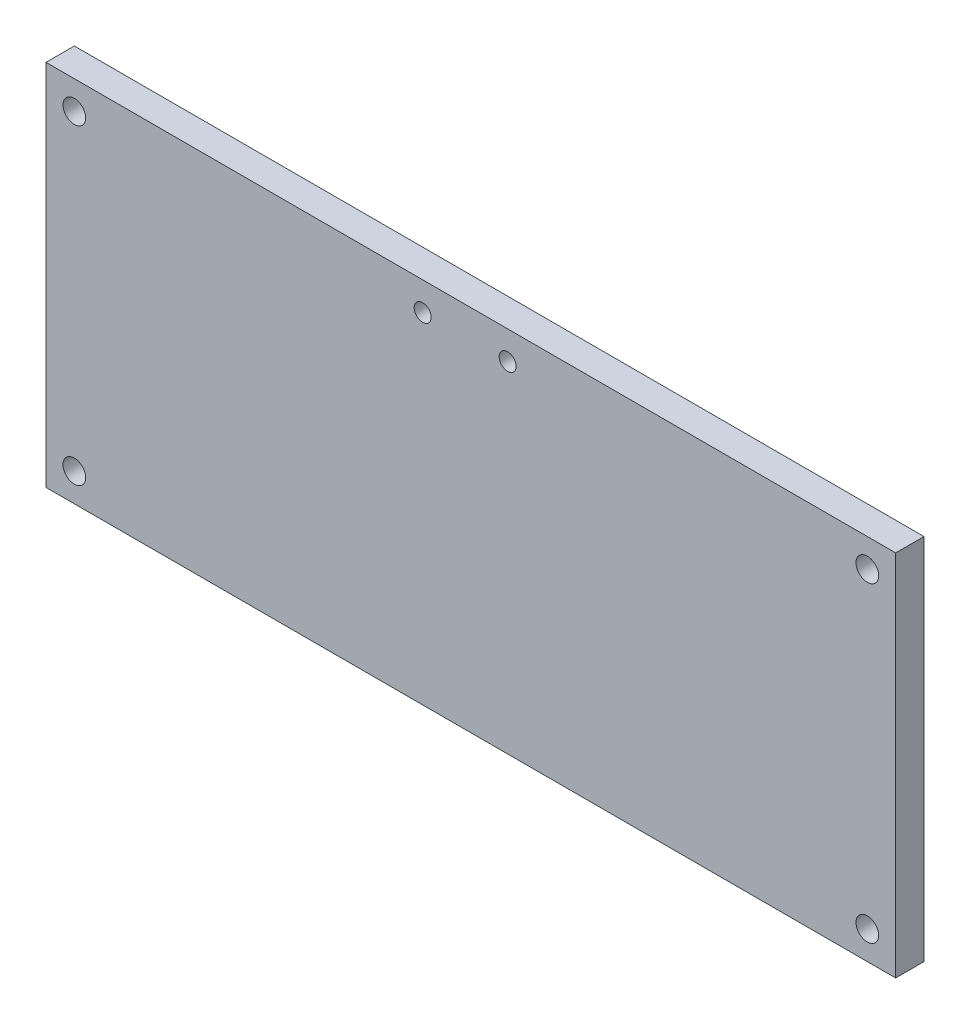
ISO-10303-21;
HEADER;
FILE_DESCRIPTION(('STEP AP214'),'2;1');
FILE_NAME('part.step','',(''),(''),'','','');
FILE_SCHEMA(('AUTOMOTIVE_DESIGN { 1 0 10303 214 1 1 1 1 }'));
ENDSEC;
DATA;
#1=APPLICATION_CONTEXT('core data for automotive mechanical design processes');
#2=APPLICATION_PROTOCOL_DEFINITION('international standard','automotive_design',2000,#1);
#3=PRODUCT_CONTEXT('',#1,'mechanical');
#4=PRODUCT('Part','Part','',(#3));
#5=PRODUCT_RELATED_PRODUCT_CATEGORY('part','',(#4));
#6=PRODUCT_DEFINITION_FORMATION('','',#4);
#7=PRODUCT_DEFINITION_CONTEXT('part definition',#1,'design');
#8=PRODUCT_DEFINITION('design','',#6,#7);
#9=PRODUCT_DEFINITION_SHAPE('','',#8);
#10=(LENGTH_UNIT() NAMED_UNIT(*) SI_UNIT(.MILLI.,.METRE.));
#11=(NAMED_UNIT(*) PLANE_ANGLE_UNIT() SI_UNIT($,.RADIAN.));
#12=(NAMED_UNIT(*) SI_UNIT($,.STERADIAN.) SOLID_ANGLE_UNIT());
#13=UNCERTAINTY_MEASURE_WITH_UNIT(LENGTH_MEASURE(1.E-05),#10,'distance_accuracy_value','');
#14=(GEOMETRIC_REPRESENTATION_CONTEXT(3) GLOBAL_UNCERTAINTY_ASSIGNED_CONTEXT((#13)) GLOBAL_UNIT_ASSIGNED_CONTEXT((#10,
#11,#12)) REPRESENTATION_CONTEXT('',''));
#15=CARTESIAN_POINT('',(0.,0.,0.));
#16=DIRECTION('',(0.,0.,1.));
#17=DIRECTION('',(1.,0.,0.));
#18=AXIS2_PLACEMENT_3D('',#15,#16,#17);
#19=CARTESIAN_POINT('',(-78.3106891706104,130.,10.));
#20=DIRECTION('',(1.,0.,0.));
#21=DIRECTION('',(0.,1.,0.));
#22=AXIS2_PLACEMENT_3D('',#19,#20,#21);
#23=PLANE('',#22);
#24=DIRECTION('',(0.,-1.,0.));
#25=VECTOR('',#24,1.);
#26=CARTESIAN_POINT('',(-78.3106891706104,130.,0.));
#27=LINE('',#26,#25);
#28=CARTESIAN_POINT('',(-78.3106891706104,130.,0.));
#29=VERTEX_POINT('',#28);
#30=CARTESIAN_POINT('',(-78.3106891706104,0.,0.));
#31=VERTEX_POINT('',#30);
#32=EDGE_CURVE('E96',#29,#31,#27,.T.);
#33=ORIENTED_EDGE('',*,*,#32,.T.);
#34=DIRECTION('',(0.,0.,-1.));
#35=VECTOR('',#34,1.);
#36=CARTESIAN_POINT('',(-78.3106891706104,0.,10.));
#37=LINE('',#36,#35);
#38=CARTESIAN_POINT('',(-78.3106891706104,0.,10.));
#39=VERTEX_POINT('',#38);
#40=EDGE_CURVE('E11',#39,#31,#37,.T.);
#41=ORIENTED_EDGE('',*,*,#40,.F.);
#42=DIRECTION('',(0.,-1.,0.));
#43=VECTOR('',#42,1.);
#44=CARTESIAN_POINT('',(-78.3106891706104,130.,10.));
#45=LINE('',#44,#43);
#46=CARTESIAN_POINT('',(-78.3106891706104,130.,10.));
#47=VERTEX_POINT('',#46);
#48=EDGE_CURVE('E84',#47,#39,#45,.T.);
#49=ORIENTED_EDGE('',*,*,#48,.F.);
#50=DIRECTION('',(0.,0.,-1.));
#51=VECTOR('',#50,1.);
#52=CARTESIAN_POINT('',(-78.3106891706104,130.,10.));
#53=LINE('',#52,#51);
#54=EDGE_CURVE('E92',#47,#29,#53,.T.);
#55=ORIENTED_EDGE('',*,*,#54,.T.);
#56=EDGE_LOOP('',(#33,#41,#49,#55));
#57=FACE_BOUND('',#56,.T.);
#58=ADVANCED_FACE('F33',(#57),#23,.F.);
#59=CARTESIAN_POINT('',(-78.3106891706104,0.,10.));
#60=DIRECTION('',(0.,1.,0.));
#61=DIRECTION('',(0.,0.,1.));
#62=AXIS2_PLACEMENT_3D('',#59,#60,#61);
#63=PLANE('',#62);
#64=DIRECTION('',(1.,0.,0.));
#65=VECTOR('',#64,1.);
#66=CARTESIAN_POINT('',(-78.3106891706104,0.,0.));
#67=LINE('',#66,#65);
#68=CARTESIAN_POINT('',(221.68931082939,0.,0.));
#69=VERTEX_POINT('',#68);
#70=EDGE_CURVE('E88',#31,#69,#67,.T.);
#71=ORIENTED_EDGE('',*,*,#70,.T.);
#72=DIRECTION('',(0.,0.,-1.));
#73=VECTOR('',#72,1.);
#74=CARTESIAN_POINT('',(221.68931082939,0.,10.));
#75=LINE('',#74,#73);
#76=CARTESIAN_POINT('',(221.68931082939,0.,10.));
#77=VERTEX_POINT('',#76);
#78=EDGE_CURVE('E41',#77,#69,#75,.T.);
#79=ORIENTED_EDGE('',*,*,#78,.F.);
#80=DIRECTION('',(1.,0.,0.));
#81=VECTOR('',#80,1.);
#82=CARTESIAN_POINT('',(-78.3106891706104,0.,10.));
#83=LINE('',#82,#81);
#84=EDGE_CURVE('E79',#39,#77,#83,.T.);
#85=ORIENTED_EDGE('',*,*,#84,.F.);
#86=ORIENTED_EDGE('',*,*,#40,.T.);
#87=EDGE_LOOP('',(#71,#79,#85,#86));
#88=FACE_BOUND('',#87,.T.);
#89=ADVANCED_FACE('F87',(#88),#63,.F.);
#90=CARTESIAN_POINT('',(221.68931082939,0.,10.));
#91=DIRECTION('',(-1.,0.,0.));
#92=DIRECTION('',(0.,0.,1.));
#93=AXIS2_PLACEMENT_3D('',#90,#91,#92);
#94=PLANE('',#93);
#95=DIRECTION('',(0.,1.,0.));
#96=VECTOR('',#95,1.);
#97=CARTESIAN_POINT('',(221.68931082939,0.,0.));
#98=LINE('',#97,#96);
#99=CARTESIAN_POINT('',(221.68931082939,130.,0.));
#100=VERTEX_POINT('',#99);
#101=EDGE_CURVE('E66',#69,#100,#98,.T.);
#102=ORIENTED_EDGE('',*,*,#101,.T.);
#103=DIRECTION('',(0.,0.,-1.));
#104=VECTOR('',#103,1.);
#105=CARTESIAN_POINT('',(221.68931082939,130.,10.));
#106=LINE('',#105,#104);
#107=CARTESIAN_POINT('',(221.68931082939,130.,10.));
#108=VERTEX_POINT('',#107);
#109=EDGE_CURVE('E89',#108,#100,#106,.T.);
#110=ORIENTED_EDGE('',*,*,#109,.F.);
#111=DIRECTION('',(0.,1.,0.));
#112=VECTOR('',#111,1.);
#113=CARTESIAN_POINT('',(221.68931082939,0.,10.));
#114=LINE('',#113,#112);
#115=EDGE_CURVE('E82',#77,#108,#114,.T.);
#116=ORIENTED_EDGE('',*,*,#115,.F.);
#117=ORIENTED_EDGE('',*,*,#78,.T.);
#118=EDGE_LOOP('',(#102,#110,#116,#117));
#119=FACE_BOUND('',#118,.T.);
#120=ADVANCED_FACE('F90',(#119),#94,.F.);
#121=CARTESIAN_POINT('',(221.68931082939,130.,10.));
#122=DIRECTION('',(0.,-1.,0.));
#123=DIRECTION('',(0.,0.,-1.));
#124=AXIS2_PLACEMENT_3D('',#121,#122,#123);
#125=PLANE('',#124);
#126=DIRECTION('',(-1.,0.,0.));
#127=VECTOR('',#126,1.);
#128=CARTESIAN_POINT('',(221.68931082939,130.,0.));
#129=LINE('',#128,#127);
#130=EDGE_CURVE('E72',#100,#29,#129,.T.);
#131=ORIENTED_EDGE('',*,*,#130,.T.);
#132=ORIENTED_EDGE('',*,*,#54,.F.);
#133=DIRECTION('',(-1.,0.,0.));
#134=VECTOR('',#133,1.);
#135=CARTESIAN_POINT('',(221.68931082939,130.,10.));
#136=LINE('',#135,#134);
#137=EDGE_CURVE('E49',#108,#47,#136,.T.);
#138=ORIENTED_EDGE('',*,*,#137,.F.);
#139=ORIENTED_EDGE('',*,*,#109,.T.);
#140=EDGE_LOOP('',(#131,#132,#138,#139));
#141=FACE_BOUND('',#140,.T.);
#142=ADVANCED_FACE('F104',(#141),#125,.F.);
#143=CARTESIAN_POINT('',(0.,0.,10.));
#144=DIRECTION('',(0.,0.,1.));
#145=DIRECTION('',(1.,0.,0.));
#146=AXIS2_PLACEMENT_3D('',#143,#144,#145);
#147=PLANE('',#146);
#148=CARTESIAN_POINT('',(54.6893108293896,120.,10.));
#149=DIRECTION('',(0.,0.,1.));
#150=DIRECTION('',(1.,0.,0.));
#151=AXIS2_PLACEMENT_3D('',#148,#149,#150);
#152=CIRCLE('',#151,3.);
#153=CARTESIAN_POINT('',(57.6893108293896,120.,10.));
#154=VERTEX_POINT('',#153);
#155=EDGE_CURVE('E140',#154,#154,#152,.T.);
#156=ORIENTED_EDGE('',*,*,#155,.F.);
#157=EDGE_LOOP('',(#156));
#158=FACE_BOUND('',#157,.T.);
#159=CARTESIAN_POINT('',(84.6893108293896,120.,10.));
#160=DIRECTION('',(0.,0.,1.));
#161=DIRECTION('',(1.,0.,0.));
#162=AXIS2_PLACEMENT_3D('',#159,#160,#161);
#163=CIRCLE('',#162,3.00000000000001);
#164=CARTESIAN_POINT('',(87.6893108293896,120.,10.));
#165=VERTEX_POINT('',#164);
#166=EDGE_CURVE('E134',#165,#165,#163,.T.);
#167=ORIENTED_EDGE('',*,*,#166,.F.);
#168=EDGE_LOOP('',(#167));
#169=FACE_BOUND('',#168,.T.);
#170=CARTESIAN_POINT('',(-68.3106891706104,9.99999999999999,10.));
#171=DIRECTION('',(0.,0.,1.));
#172=DIRECTION('',(1.,0.,0.));
#173=AXIS2_PLACEMENT_3D('',#170,#171,#172);
#174=CIRCLE('',#173,4.00000000000001);
#175=CARTESIAN_POINT('',(-64.3106891706104,9.99999999999999,10.));
#176=VERTEX_POINT('',#175);
#177=EDGE_CURVE('E129',#176,#176,#174,.T.);
#178=ORIENTED_EDGE('',*,*,#177,.F.);
#179=EDGE_LOOP('',(#178));
#180=FACE_BOUND('',#179,.T.);
#181=CARTESIAN_POINT('',(211.68931082939,10.,10.));
#182=DIRECTION('',(0.,0.,1.));
#183=DIRECTION('',(1.,0.,0.));
#184=AXIS2_PLACEMENT_3D('',#181,#182,#183);
#185=CIRCLE('',#184,3.99999999999999);
#186=CARTESIAN_POINT('',(215.68931082939,10.,10.));
#187=VERTEX_POINT('',#186);
#188=EDGE_CURVE('E123',#187,#187,#185,.T.);
#189=ORIENTED_EDGE('',*,*,#188,.F.);
#190=EDGE_LOOP('',(#189));
#191=FACE_BOUND('',#190,.T.);
#192=CARTESIAN_POINT('',(211.68931082939,120.,10.));
#193=DIRECTION('',(0.,0.,1.));
#194=DIRECTION('',(1.,0.,0.));
#195=AXIS2_PLACEMENT_3D('',#192,#193,#194);
#196=CIRCLE('',#195,3.99999999999999);
#197=CARTESIAN_POINT('',(215.68931082939,120.,10.));
#198=VERTEX_POINT('',#197);
#199=EDGE_CURVE('E116',#198,#198,#196,.T.);
#200=ORIENTED_EDGE('',*,*,#199,.F.);
#201=EDGE_LOOP('',(#200));
#202=FACE_BOUND('',#201,.T.);
#203=CARTESIAN_POINT('',(-68.3106891706104,120.,10.));
#204=DIRECTION('',(0.,0.,1.));
#205=DIRECTION('',(1.,0.,0.));
#206=AXIS2_PLACEMENT_3D('',#203,#204,#205);
#207=CIRCLE('',#206,4.00000000000001);
#208=CARTESIAN_POINT('',(-64.3106891706104,120.,10.));
#209=VERTEX_POINT('',#208);
#210=EDGE_CURVE('E110',#209,#209,#207,.T.);
#211=ORIENTED_EDGE('',*,*,#210,.F.);
#212=EDGE_LOOP('',(#211));
#213=FACE_BOUND('',#212,.T.);
#214=ORIENTED_EDGE('',*,*,#48,.T.);
#215=ORIENTED_EDGE('',*,*,#84,.T.);
#216=ORIENTED_EDGE('',*,*,#115,.T.);
#217=ORIENTED_EDGE('',*,*,#137,.T.);
#218=EDGE_LOOP('',(#214,#215,#216,#217));
#219=FACE_BOUND('',#218,.T.);
#220=ADVANCED_FACE('F80',(#158,#169,#180,#191,#202,#213,#219),#147,.T.);
#221=CARTESIAN_POINT('',(0.,0.,0.));
#222=DIRECTION('',(0.,0.,1.));
#223=DIRECTION('',(1.,0.,0.));
#224=AXIS2_PLACEMENT_3D('',#221,#222,#223);
#225=PLANE('',#224);
#226=CARTESIAN_POINT('',(54.6893108293896,120.,0.));
#227=DIRECTION('',(0.,0.,1.));
#228=DIRECTION('',(1.,0.,0.));
#229=AXIS2_PLACEMENT_3D('',#226,#227,#228);
#230=CIRCLE('',#229,3.);
#231=CARTESIAN_POINT('',(57.6893108293896,120.,0.));
#232=VERTEX_POINT('',#231);
#233=EDGE_CURVE('E137',#232,#232,#230,.T.);
#234=ORIENTED_EDGE('',*,*,#233,.T.);
#235=EDGE_LOOP('',(#234));
#236=FACE_BOUND('',#235,.T.);
#237=CARTESIAN_POINT('',(84.6893108293896,120.,0.));
#238=DIRECTION('',(0.,0.,1.));
#239=DIRECTION('',(1.,0.,0.));
#240=AXIS2_PLACEMENT_3D('',#237,#238,#239);
#241=CIRCLE('',#240,3.00000000000001);
#242=CARTESIAN_POINT('',(87.6893108293896,120.,0.));
#243=VERTEX_POINT('',#242);
#244=EDGE_CURVE('E120',#243,#243,#241,.T.);
#245=ORIENTED_EDGE('',*,*,#244,.T.);
#246=EDGE_LOOP('',(#245));
#247=FACE_BOUND('',#246,.T.);
#248=CARTESIAN_POINT('',(-68.3106891706104,9.99999999999999,0.));
#249=DIRECTION('',(0.,0.,1.));
#250=DIRECTION('',(1.,0.,0.));
#251=AXIS2_PLACEMENT_3D('',#248,#249,#250);
#252=CIRCLE('',#251,4.00000000000001);
#253=CARTESIAN_POINT('',(-64.3106891706104,9.99999999999999,0.));
#254=VERTEX_POINT('',#253);
#255=EDGE_CURVE('E113',#254,#254,#252,.T.);
#256=ORIENTED_EDGE('',*,*,#255,.T.);
#257=EDGE_LOOP('',(#256));
#258=FACE_BOUND('',#257,.T.);
#259=CARTESIAN_POINT('',(211.68931082939,10.,0.));
#260=DIRECTION('',(0.,0.,1.));
#261=DIRECTION('',(1.,0.,0.));
#262=AXIS2_PLACEMENT_3D('',#259,#260,#261);
#263=CIRCLE('',#262,3.99999999999999);
#264=CARTESIAN_POINT('',(215.68931082939,10.,0.));
#265=VERTEX_POINT('',#264);
#266=EDGE_CURVE('E126',#265,#265,#263,.T.);
#267=ORIENTED_EDGE('',*,*,#266,.T.);
#268=EDGE_LOOP('',(#267));
#269=FACE_BOUND('',#268,.T.);
#270=CARTESIAN_POINT('',(211.68931082939,120.,0.));
#271=DIRECTION('',(0.,0.,1.));
#272=DIRECTION('',(1.,0.,0.));
#273=AXIS2_PLACEMENT_3D('',#270,#271,#272);
#274=CIRCLE('',#273,3.99999999999999);
#275=CARTESIAN_POINT('',(215.68931082939,120.,0.));
#276=VERTEX_POINT('',#275);
#277=EDGE_CURVE('E119',#276,#276,#274,.T.);
#278=ORIENTED_EDGE('',*,*,#277,.T.);
#279=EDGE_LOOP('',(#278));
#280=FACE_BOUND('',#279,.T.);
#281=CARTESIAN_POINT('',(-68.3106891706104,120.,0.));
#282=DIRECTION('',(0.,0.,1.));
#283=DIRECTION('',(1.,0.,0.));
#284=AXIS2_PLACEMENT_3D('',#281,#282,#283);
#285=CIRCLE('',#284,4.00000000000001);
#286=CARTESIAN_POINT('',(-64.3106891706104,120.,0.));
#287=VERTEX_POINT('',#286);
#288=EDGE_CURVE('E99',#287,#287,#285,.T.);
#289=ORIENTED_EDGE('',*,*,#288,.T.);
#290=EDGE_LOOP('',(#289));
#291=FACE_BOUND('',#290,.T.);
#292=ORIENTED_EDGE('',*,*,#32,.F.);
#293=ORIENTED_EDGE('',*,*,#130,.F.);
#294=ORIENTED_EDGE('',*,*,#101,.F.);
#295=ORIENTED_EDGE('',*,*,#70,.F.);
#296=EDGE_LOOP('',(#292,#293,#294,#295));
#297=FACE_BOUND('',#296,.T.);
#298=ADVANCED_FACE('F107',(#236,#247,#258,#269,#280,#291,#297),#225,.F.);
#299=CARTESIAN_POINT('',(-68.3106891706104,120.,0.));
#300=DIRECTION('',(0.,0.,1.));
#301=DIRECTION('',(1.,0.,0.));
#302=AXIS2_PLACEMENT_3D('',#299,#300,#301);
#303=CYLINDRICAL_SURFACE('',#302,4.00000000000001);
#304=ORIENTED_EDGE('',*,*,#288,.F.);
#305=EDGE_LOOP('',(#304));
#306=FACE_BOUND('',#305,.T.);
#307=ORIENTED_EDGE('',*,*,#210,.T.);
#308=EDGE_LOOP('',(#307));
#309=FACE_BOUND('',#308,.T.);
#310=ADVANCED_FACE('F168',(#306,#309),#303,.F.);
#311=CARTESIAN_POINT('',(211.68931082939,120.,0.));
#312=DIRECTION('',(0.,0.,1.));
#313=DIRECTION('',(1.,0.,0.));
#314=AXIS2_PLACEMENT_3D('',#311,#312,#313);
#315=CYLINDRICAL_SURFACE('',#314,3.99999999999999);
#316=ORIENTED_EDGE('',*,*,#277,.F.);
#317=EDGE_LOOP('',(#316));
#318=FACE_BOUND('',#317,.T.);
#319=ORIENTED_EDGE('',*,*,#199,.T.);
#320=EDGE_LOOP('',(#319));
#321=FACE_BOUND('',#320,.T.);
#322=ADVANCED_FACE('F170',(#318,#321),#315,.F.);
#323=CARTESIAN_POINT('',(211.68931082939,10.,0.));
#324=DIRECTION('',(0.,0.,1.));
#325=DIRECTION('',(1.,0.,0.));
#326=AXIS2_PLACEMENT_3D('',#323,#324,#325);
#327=CYLINDRICAL_SURFACE('',#326,3.99999999999999);
#328=ORIENTED_EDGE('',*,*,#266,.F.);
#329=EDGE_LOOP('',(#328));
#330=FACE_BOUND('',#329,.T.);
#331=ORIENTED_EDGE('',*,*,#188,.T.);
#332=EDGE_LOOP('',(#331));
#333=FACE_BOUND('',#332,.T.);
#334=ADVANCED_FACE('F177',(#330,#333),#327,.F.);
#335=CARTESIAN_POINT('',(-68.3106891706104,9.99999999999999,0.));
#336=DIRECTION('',(0.,0.,1.));
#337=DIRECTION('',(1.,0.,0.));
#338=AXIS2_PLACEMENT_3D('',#335,#336,#337);
#339=CYLINDRICAL_SURFACE('',#338,4.00000000000001);
#340=ORIENTED_EDGE('',*,*,#255,.F.);
#341=EDGE_LOOP('',(#340));
#342=FACE_BOUND('',#341,.T.);
#343=ORIENTED_EDGE('',*,*,#177,.T.);
#344=EDGE_LOOP('',(#343));
#345=FACE_BOUND('',#344,.T.);
#346=ADVANCED_FACE('F215',(#342,#345),#339,.F.);
#347=CARTESIAN_POINT('',(84.6893108293896,120.,0.));
#348=DIRECTION('',(0.,0.,1.));
#349=DIRECTION('',(1.,0.,0.));
#350=AXIS2_PLACEMENT_3D('',#347,#348,#349);
#351=CYLINDRICAL_SURFACE('',#350,3.00000000000001);
#352=ORIENTED_EDGE('',*,*,#244,.F.);
#353=EDGE_LOOP('',(#352));
#354=FACE_BOUND('',#353,.T.);
#355=ORIENTED_EDGE('',*,*,#166,.T.);
#356=EDGE_LOOP('',(#355));
#357=FACE_BOUND('',#356,.T.);
#358=ADVANCED_FACE('F151',(#354,#357),#351,.F.);
#359=CARTESIAN_POINT('',(54.6893108293896,120.,0.));
#360=DIRECTION('',(0.,0.,1.));
#361=DIRECTION('',(1.,0.,0.));
#362=AXIS2_PLACEMENT_3D('',#359,#360,#361);
#363=CYLINDRICAL_SURFACE('',#362,3.);
#364=ORIENTED_EDGE('',*,*,#233,.F.);
#365=EDGE_LOOP('',(#364));
#366=FACE_BOUND('',#365,.T.);
#367=ORIENTED_EDGE('',*,*,#155,.T.);
#368=EDGE_LOOP('',(#367));
#369=FACE_BOUND('',#368,.T.);
#370=ADVANCED_FACE('F148',(#366,#369),#363,.F.);
#371=CLOSED_SHELL('',(#58,#89,#120,#142,#220,#298,#310,#322,#334,#346,#358,#370));
#372=MANIFOLD_SOLID_BREP('B2',#371);
#373=ADVANCED_BREP_SHAPE_REPRESENTATION('',(#18,#372),#14);
#374=SHAPE_DEFINITION_REPRESENTATION(#9,#373);
ENDSEC;
END-ISO-10303-21;
